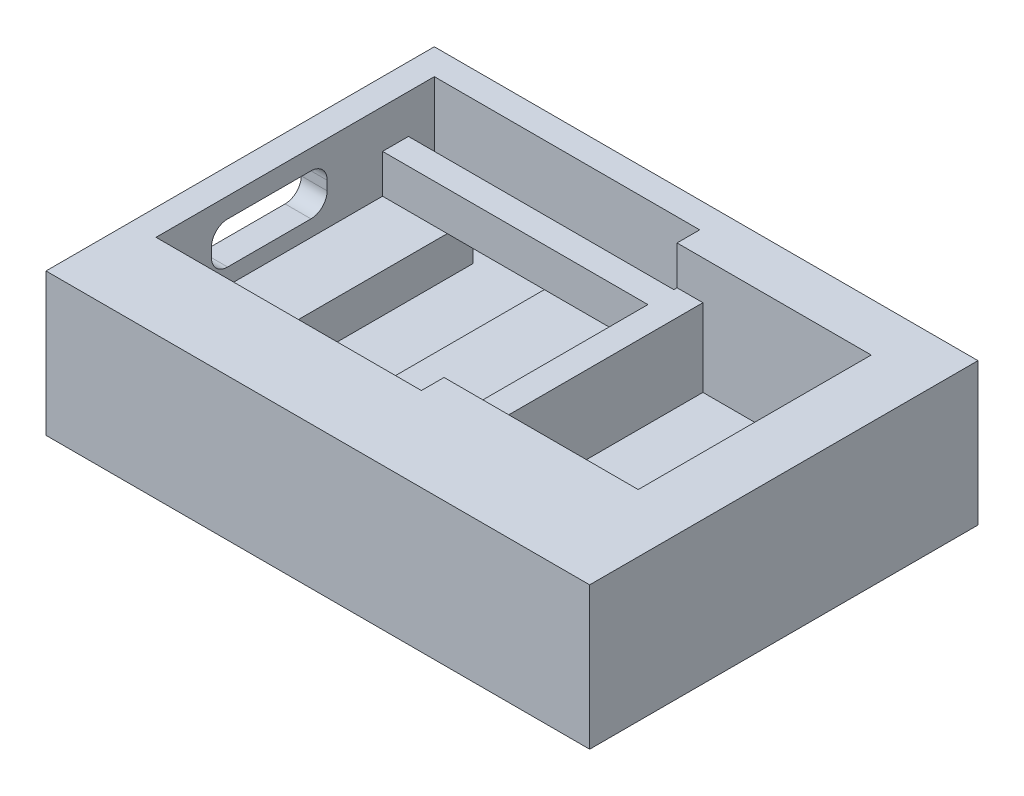
ISO-10303-21;
HEADER;
FILE_DESCRIPTION(('STEP AP214'),'2;1');
FILE_NAME('part.step','',(''),(''),'','','');
FILE_SCHEMA(('AUTOMOTIVE_DESIGN { 1 0 10303 214 1 1 1 1 }'));
ENDSEC;
DATA;
#1=APPLICATION_CONTEXT('core data for automotive mechanical design processes');
#2=APPLICATION_PROTOCOL_DEFINITION('international standard','automotive_design',2000,#1);
#3=PRODUCT_CONTEXT('',#1,'mechanical');
#4=PRODUCT('Part','Part','',(#3));
#5=PRODUCT_RELATED_PRODUCT_CATEGORY('part','',(#4));
#6=PRODUCT_DEFINITION_FORMATION('','',#4);
#7=PRODUCT_DEFINITION_CONTEXT('part definition',#1,'design');
#8=PRODUCT_DEFINITION('design','',#6,#7);
#9=PRODUCT_DEFINITION_SHAPE('','',#8);
#10=(LENGTH_UNIT() NAMED_UNIT(*) SI_UNIT(.MILLI.,.METRE.));
#11=(NAMED_UNIT(*) PLANE_ANGLE_UNIT() SI_UNIT($,.RADIAN.));
#12=(NAMED_UNIT(*) SI_UNIT($,.STERADIAN.) SOLID_ANGLE_UNIT());
#13=UNCERTAINTY_MEASURE_WITH_UNIT(LENGTH_MEASURE(1.E-05),#10,'distance_accuracy_value','');
#14=(GEOMETRIC_REPRESENTATION_CONTEXT(3) GLOBAL_UNCERTAINTY_ASSIGNED_CONTEXT((#13)) GLOBAL_UNIT_ASSIGNED_CONTEXT((#10,
#11,#12)) REPRESENTATION_CONTEXT('',''));
#15=CARTESIAN_POINT('',(0.,0.,0.));
#16=DIRECTION('',(0.,0.,1.));
#17=DIRECTION('',(1.,0.,0.));
#18=AXIS2_PLACEMENT_3D('',#15,#16,#17);
#19=CARTESIAN_POINT('',(2.,11.,-19.5));
#20=DIRECTION('',(0.,0.,1.));
#21=DIRECTION('',(1.,0.,0.));
#22=AXIS2_PLACEMENT_3D('',#19,#20,#21);
#23=PLANE('',#22);
#24=DIRECTION('',(0.,-1.,0.));
#25=VECTOR('',#24,1.);
#26=CARTESIAN_POINT('',(22.5,11.,-19.5));
#27=LINE('',#26,#25);
#28=CARTESIAN_POINT('',(22.5,8.,-19.5));
#29=VERTEX_POINT('',#28);
#30=CARTESIAN_POINT('',(22.5,5.,-19.5));
#31=VERTEX_POINT('',#30);
#32=EDGE_CURVE('E524',#29,#31,#27,.T.);
#33=ORIENTED_EDGE('',*,*,#32,.F.);
#34=DIRECTION('',(1.,0.,0.));
#35=VECTOR('',#34,1.);
#36=CARTESIAN_POINT('',(22.5,8.,-19.5));
#37=LINE('',#36,#35);
#38=CARTESIAN_POINT('',(2.,8.,-19.5));
#39=VERTEX_POINT('',#38);
#40=EDGE_CURVE('E391',#39,#29,#37,.T.);
#41=ORIENTED_EDGE('',*,*,#40,.F.);
#42=DIRECTION('',(0.,-1.,0.));
#43=VECTOR('',#42,1.);
#44=CARTESIAN_POINT('',(2.,11.,-19.5));
#45=LINE('',#44,#43);
#46=CARTESIAN_POINT('',(2.,5.,-19.5));
#47=VERTEX_POINT('',#46);
#48=EDGE_CURVE('E518',#39,#47,#45,.T.);
#49=ORIENTED_EDGE('',*,*,#48,.T.);
#50=DIRECTION('',(1.,0.,0.));
#51=VECTOR('',#50,1.);
#52=CARTESIAN_POINT('',(2.,5.,-19.5));
#53=LINE('',#52,#51);
#54=CARTESIAN_POINT('',(7.,5.,-19.5));
#55=VERTEX_POINT('',#54);
#56=EDGE_CURVE('E439',#47,#55,#53,.T.);
#57=ORIENTED_EDGE('',*,*,#56,.T.);
#58=DIRECTION('',(-1.,0.,0.));
#59=VECTOR('',#58,1.);
#60=CARTESIAN_POINT('',(7.,5.,-19.5));
#61=LINE('',#60,#59);
#62=CARTESIAN_POINT('',(14.5,5.,-19.5));
#63=VERTEX_POINT('',#62);
#64=EDGE_CURVE('E405',#63,#55,#61,.T.);
#65=ORIENTED_EDGE('',*,*,#64,.F.);
#66=DIRECTION('',(-1.,0.,0.));
#67=VECTOR('',#66,1.);
#68=CARTESIAN_POINT('',(22.5,5.,-19.5));
#69=LINE('',#68,#67);
#70=EDGE_CURVE('E431',#31,#63,#69,.T.);
#71=ORIENTED_EDGE('',*,*,#70,.F.);
#72=EDGE_LOOP('',(#33,#41,#49,#57,#65,#71));
#73=FACE_BOUND('',#72,.T.);
#74=ADVANCED_FACE('F47',(#73),#23,.T.);
#75=CARTESIAN_POINT('',(24.5,11.,-21.75));
#76=DIRECTION('',(1.,0.,0.));
#77=DIRECTION('',(0.,0.,-1.));
#78=AXIS2_PLACEMENT_3D('',#75,#76,#77);
#79=PLANE('',#78);
#80=DIRECTION('',(0.,-1.,0.));
#81=VECTOR('',#80,1.);
#82=CARTESIAN_POINT('',(24.5,11.,-21.75));
#83=LINE('',#82,#81);
#84=CARTESIAN_POINT('',(24.5,8.,-21.75));
#85=VERTEX_POINT('',#84);
#86=CARTESIAN_POINT('',(24.5,2.,-21.75));
#87=VERTEX_POINT('',#86);
#88=EDGE_CURVE('E547',#85,#87,#83,.T.);
#89=ORIENTED_EDGE('',*,*,#88,.F.);
#90=DIRECTION('',(0.,0.,-1.));
#91=VECTOR('',#90,1.);
#92=CARTESIAN_POINT('',(24.5,8.,-3.75));
#93=LINE('',#92,#91);
#94=CARTESIAN_POINT('',(24.5,8.,-3.75));
#95=VERTEX_POINT('',#94);
#96=EDGE_CURVE('E354',#95,#85,#93,.T.);
#97=ORIENTED_EDGE('',*,*,#96,.F.);
#98=DIRECTION('',(0.,-1.,0.));
#99=VECTOR('',#98,1.);
#100=CARTESIAN_POINT('',(24.5,11.,-3.75));
#101=LINE('',#100,#99);
#102=CARTESIAN_POINT('',(24.5,2.,-3.75));
#103=VERTEX_POINT('',#102);
#104=EDGE_CURVE('E571',#95,#103,#101,.T.);
#105=ORIENTED_EDGE('',*,*,#104,.T.);
#106=DIRECTION('',(0.,0.,1.));
#107=VECTOR('',#106,1.);
#108=CARTESIAN_POINT('',(24.5,2.,-21.75));
#109=LINE('',#108,#107);
#110=EDGE_CURVE('E535',#87,#103,#109,.T.);
#111=ORIENTED_EDGE('',*,*,#110,.F.);
#112=EDGE_LOOP('',(#89,#97,#105,#111));
#113=FACE_BOUND('',#112,.T.);
#114=ADVANCED_FACE('F645',(#113),#79,.T.);
#115=CARTESIAN_POINT('',(2.,11.,-21.5));
#116=DIRECTION('',(0.,0.,-1.));
#117=DIRECTION('',(-1.,0.,0.));
#118=AXIS2_PLACEMENT_3D('',#115,#116,#117);
#119=PLANE('',#118);
#120=DIRECTION('',(0.,-1.,0.));
#121=VECTOR('',#120,1.);
#122=CARTESIAN_POINT('',(2.,11.,-21.5));
#123=LINE('',#122,#121);
#124=CARTESIAN_POINT('',(2.,8.,-21.5));
#125=VERTEX_POINT('',#124);
#126=CARTESIAN_POINT('',(2.,2.,-21.5));
#127=VERTEX_POINT('',#126);
#128=EDGE_CURVE('E497',#125,#127,#123,.T.);
#129=ORIENTED_EDGE('',*,*,#128,.F.);
#130=DIRECTION('',(-1.,0.,0.));
#131=VECTOR('',#130,1.);
#132=CARTESIAN_POINT('',(22.5,8.,-21.5));
#133=LINE('',#132,#131);
#134=CARTESIAN_POINT('',(22.5,8.,-21.5));
#135=VERTEX_POINT('',#134);
#136=EDGE_CURVE('E384',#135,#125,#133,.T.);
#137=ORIENTED_EDGE('',*,*,#136,.F.);
#138=DIRECTION('',(0.,-1.,0.));
#139=VECTOR('',#138,1.);
#140=CARTESIAN_POINT('',(22.5,11.,-21.5));
#141=LINE('',#140,#139);
#142=CARTESIAN_POINT('',(22.5,2.,-21.5));
#143=VERTEX_POINT('',#142);
#144=EDGE_CURVE('E479',#135,#143,#141,.T.);
#145=ORIENTED_EDGE('',*,*,#144,.T.);
#146=DIRECTION('',(1.,0.,0.));
#147=VECTOR('',#146,1.);
#148=CARTESIAN_POINT('',(2.,2.,-21.5));
#149=LINE('',#148,#147);
#150=CARTESIAN_POINT('',(14.5,2.,-21.5));
#151=VERTEX_POINT('',#150);
#152=EDGE_CURVE('E491',#151,#143,#149,.T.);
#153=ORIENTED_EDGE('',*,*,#152,.F.);
#154=DIRECTION('',(0.,-1.,0.));
#155=VECTOR('',#154,1.);
#156=CARTESIAN_POINT('',(14.5,11.,-21.5));
#157=LINE('',#156,#155);
#158=CARTESIAN_POINT('',(14.5,5.,-21.5));
#159=VERTEX_POINT('',#158);
#160=EDGE_CURVE('E416',#159,#151,#157,.T.);
#161=ORIENTED_EDGE('',*,*,#160,.F.);
#162=DIRECTION('',(1.,0.,0.));
#163=VECTOR('',#162,1.);
#164=CARTESIAN_POINT('',(2.,5.,-21.5));
#165=LINE('',#164,#163);
#166=CARTESIAN_POINT('',(7.,5.,-21.5));
#167=VERTEX_POINT('',#166);
#168=EDGE_CURVE('E11',#167,#159,#165,.T.);
#169=ORIENTED_EDGE('',*,*,#168,.F.);
#170=DIRECTION('',(0.,1.,0.));
#171=VECTOR('',#170,1.);
#172=CARTESIAN_POINT('',(7.,11.,-21.5));
#173=LINE('',#172,#171);
#174=CARTESIAN_POINT('',(7.,2.,-21.5));
#175=VERTEX_POINT('',#174);
#176=EDGE_CURVE('E422',#175,#167,#173,.T.);
#177=ORIENTED_EDGE('',*,*,#176,.F.);
#178=EDGE_CURVE('E475',#127,#175,#149,.T.);
#179=ORIENTED_EDGE('',*,*,#178,.F.);
#180=EDGE_LOOP('',(#129,#137,#145,#153,#161,#169,#177,#179));
#181=FACE_BOUND('',#180,.T.);
#182=ADVANCED_FACE('F669',(#181),#119,.T.);
#183=CARTESIAN_POINT('',(2.,11.,-2.));
#184=DIRECTION('',(0.,0.,-1.));
#185=DIRECTION('',(-1.,0.,0.));
#186=AXIS2_PLACEMENT_3D('',#183,#184,#185);
#187=PLANE('',#186);
#188=DIRECTION('',(0.,-1.,0.));
#189=VECTOR('',#188,1.);
#190=CARTESIAN_POINT('',(22.5,11.,-2.));
#191=LINE('',#190,#189);
#192=CARTESIAN_POINT('',(22.5,11.,-2.));
#193=VERTEX_POINT('',#192);
#194=CARTESIAN_POINT('',(22.5,5.,-1.99999999999999));
#195=VERTEX_POINT('',#194);
#196=EDGE_CURVE('E527',#193,#195,#191,.T.);
#197=ORIENTED_EDGE('',*,*,#196,.T.);
#198=DIRECTION('',(-1.,0.,0.));
#199=VECTOR('',#198,1.);
#200=CARTESIAN_POINT('',(22.5,5.,-1.99999999999999));
#201=LINE('',#200,#199);
#202=CARTESIAN_POINT('',(14.5,5.,-1.99999999999999));
#203=VERTEX_POINT('',#202);
#204=EDGE_CURVE('E430',#195,#203,#201,.T.);
#205=ORIENTED_EDGE('',*,*,#204,.T.);
#206=DIRECTION('',(0.,1.,0.));
#207=VECTOR('',#206,1.);
#208=CARTESIAN_POINT('',(14.5,2.,-1.99999999999999));
#209=LINE('',#208,#207);
#210=CARTESIAN_POINT('',(14.5,2.,-1.99999999999999));
#211=VERTEX_POINT('',#210);
#212=EDGE_CURVE('E426',#211,#203,#209,.T.);
#213=ORIENTED_EDGE('',*,*,#212,.F.);
#214=DIRECTION('',(1.,0.,0.));
#215=VECTOR('',#214,1.);
#216=CARTESIAN_POINT('',(2.,2.,-2.));
#217=LINE('',#216,#215);
#218=CARTESIAN_POINT('',(7.,2.,-2.));
#219=VERTEX_POINT('',#218);
#220=EDGE_CURVE('E507',#219,#211,#217,.T.);
#221=ORIENTED_EDGE('',*,*,#220,.F.);
#222=DIRECTION('',(0.,1.,0.));
#223=VECTOR('',#222,1.);
#224=CARTESIAN_POINT('',(7.,2.,-1.99999999999999));
#225=LINE('',#224,#223);
#226=CARTESIAN_POINT('',(7.,5.,-2.));
#227=VERTEX_POINT('',#226);
#228=EDGE_CURVE('E465',#219,#227,#225,.T.);
#229=ORIENTED_EDGE('',*,*,#228,.T.);
#230=DIRECTION('',(1.,0.,0.));
#231=VECTOR('',#230,1.);
#232=CARTESIAN_POINT('',(2.,5.,-1.99999999999999));
#233=LINE('',#232,#231);
#234=CARTESIAN_POINT('',(2.,5.,-2.));
#235=VERTEX_POINT('',#234);
#236=EDGE_CURVE('E461',#235,#227,#233,.T.);
#237=ORIENTED_EDGE('',*,*,#236,.F.);
#238=DIRECTION('',(0.,-1.,0.));
#239=VECTOR('',#238,1.);
#240=CARTESIAN_POINT('',(2.,11.,-2.));
#241=LINE('',#240,#239);
#242=CARTESIAN_POINT('',(2.,11.,-2.));
#243=VERTEX_POINT('',#242);
#244=EDGE_CURVE('E531',#243,#235,#241,.T.);
#245=ORIENTED_EDGE('',*,*,#244,.F.);
#246=DIRECTION('',(1.,0.,0.));
#247=VECTOR('',#246,1.);
#248=CARTESIAN_POINT('',(2.,11.,-2.));
#249=LINE('',#248,#247);
#250=EDGE_CURVE('E511',#243,#193,#249,.T.);
#251=ORIENTED_EDGE('',*,*,#250,.T.);
#252=EDGE_LOOP('',(#197,#205,#213,#221,#229,#237,#245,#251));
#253=FACE_BOUND('',#252,.T.);
#254=ADVANCED_FACE('F612',(#253),#187,.T.);
#255=CARTESIAN_POINT('',(22.5,11.,-2.));
#256=DIRECTION('',(-1.,0.,0.));
#257=DIRECTION('',(0.,0.,1.));
#258=AXIS2_PLACEMENT_3D('',#255,#256,#257);
#259=PLANE('',#258);
#260=DIRECTION('',(0.,1.,0.));
#261=VECTOR('',#260,1.);
#262=CARTESIAN_POINT('',(22.5,8.,-3.75));
#263=LINE('',#262,#261);
#264=CARTESIAN_POINT('',(22.5,8.,-3.75));
#265=VERTEX_POINT('',#264);
#266=CARTESIAN_POINT('',(22.5,11.,-3.75));
#267=VERTEX_POINT('',#266);
#268=EDGE_CURVE('E401',#265,#267,#263,.T.);
#269=ORIENTED_EDGE('',*,*,#268,.F.);
#270=DIRECTION('',(0.,0.,1.));
#271=VECTOR('',#270,1.);
#272=CARTESIAN_POINT('',(22.5,8.,-3.75));
#273=LINE('',#272,#271);
#274=EDGE_CURVE('E394',#29,#265,#273,.T.);
#275=ORIENTED_EDGE('',*,*,#274,.F.);
#276=ORIENTED_EDGE('',*,*,#32,.T.);
#277=DIRECTION('',(0.,0.,-1.));
#278=VECTOR('',#277,1.);
#279=CARTESIAN_POINT('',(22.5,5.,-1.99999999999999));
#280=LINE('',#279,#278);
#281=EDGE_CURVE('E440',#195,#31,#280,.T.);
#282=ORIENTED_EDGE('',*,*,#281,.F.);
#283=ORIENTED_EDGE('',*,*,#196,.F.);
#284=DIRECTION('',(0.,0.,-1.));
#285=VECTOR('',#284,1.);
#286=CARTESIAN_POINT('',(22.5,11.,-2.));
#287=LINE('',#286,#285);
#288=EDGE_CURVE('E514',#193,#267,#287,.T.);
#289=ORIENTED_EDGE('',*,*,#288,.T.);
#290=EDGE_LOOP('',(#269,#275,#276,#282,#283,#289));
#291=FACE_BOUND('',#290,.T.);
#292=ADVANCED_FACE('F609',(#291),#259,.T.);
#293=CARTESIAN_POINT('',(0.,2.,-25.5));
#294=DIRECTION('',(0.,0.,-1.));
#295=DIRECTION('',(-1.,0.,0.));
#296=AXIS2_PLACEMENT_3D('',#293,#294,#295);
#297=PLANE('',#296);
#298=DIRECTION('',(1.,0.,0.));
#299=VECTOR('',#298,1.);
#300=CARTESIAN_POINT('',(0.,0.,-25.5));
#301=LINE('',#300,#299);
#302=CARTESIAN_POINT('',(0.,0.,-25.5));
#303=VERTEX_POINT('',#302);
#304=CARTESIAN_POINT('',(42.,0.,-25.5));
#305=VERTEX_POINT('',#304);
#306=EDGE_CURVE('E268',#303,#305,#301,.T.);
#307=ORIENTED_EDGE('',*,*,#306,.F.);
#308=DIRECTION('',(0.,-1.,0.));
#309=VECTOR('',#308,1.);
#310=CARTESIAN_POINT('',(0.,2.,-25.5));
#311=LINE('',#310,#309);
#312=CARTESIAN_POINT('',(0.,11.,-25.5));
#313=VERTEX_POINT('',#312);
#314=EDGE_CURVE('E56',#313,#303,#311,.T.);
#315=ORIENTED_EDGE('',*,*,#314,.F.);
#316=DIRECTION('',(-1.,0.,0.));
#317=VECTOR('',#316,1.);
#318=CARTESIAN_POINT('',(24.5,11.,-25.5));
#319=LINE('',#318,#317);
#320=CARTESIAN_POINT('',(42.,11.,-25.5));
#321=VERTEX_POINT('',#320);
#322=EDGE_CURVE('E574',#321,#313,#319,.T.);
#323=ORIENTED_EDGE('',*,*,#322,.F.);
#324=DIRECTION('',(0.,1.,0.));
#325=VECTOR('',#324,1.);
#326=CARTESIAN_POINT('',(42.,11.,-25.5));
#327=LINE('',#326,#325);
#328=EDGE_CURVE('E273',#305,#321,#327,.T.);
#329=ORIENTED_EDGE('',*,*,#328,.F.);
#330=EDGE_LOOP('',(#307,#315,#323,#329));
#331=FACE_BOUND('',#330,.T.);
#332=ADVANCED_FACE('F589',(#331),#297,.T.);
#333=CARTESIAN_POINT('',(0.,2.,-25.5));
#334=DIRECTION('',(1.,0.,0.));
#335=DIRECTION('',(0.,0.,-1.));
#336=AXIS2_PLACEMENT_3D('',#333,#334,#335);
#337=PLANE('',#336);
#338=DIRECTION('',(0.,-1.,0.));
#339=VECTOR('',#338,1.);
#340=CARTESIAN_POINT('',(0.,7.5,-6.28));
#341=LINE('',#340,#339);
#342=CARTESIAN_POINT('',(0.,8.21,-6.27999999999999));
#343=VERTEX_POINT('',#342);
#344=CARTESIAN_POINT('',(0.,7.5,-6.28));
#345=VERTEX_POINT('',#344);
#346=EDGE_CURVE('E317',#343,#345,#341,.T.);
#347=ORIENTED_EDGE('',*,*,#346,.T.);
#348=CARTESIAN_POINT('',(0.,7.5,-7.52999999999999));
#349=DIRECTION('',(1.,0.,0.));
#350=DIRECTION('',(0.,0.,-1.));
#351=AXIS2_PLACEMENT_3D('',#348,#349,#350);
#352=CIRCLE('',#351,1.25);
#353=CARTESIAN_POINT('',(0.,6.25,-7.52999999999999));
#354=VERTEX_POINT('',#353);
#355=EDGE_CURVE('E290',#345,#354,#352,.T.);
#356=ORIENTED_EDGE('',*,*,#355,.T.);
#357=DIRECTION('',(0.,0.,-1.));
#358=VECTOR('',#357,1.);
#359=CARTESIAN_POINT('',(0.,6.25,-7.52999999999999));
#360=LINE('',#359,#358);
#361=CARTESIAN_POINT('',(0.,6.25,-13.97));
#362=VERTEX_POINT('',#361);
#363=EDGE_CURVE('E294',#354,#362,#360,.T.);
#364=ORIENTED_EDGE('',*,*,#363,.T.);
#365=CARTESIAN_POINT('',(0.,7.5,-13.97));
#366=DIRECTION('',(1.,0.,0.));
#367=DIRECTION('',(0.,0.,-1.));
#368=AXIS2_PLACEMENT_3D('',#365,#366,#367);
#369=CIRCLE('',#368,1.25);
#370=CARTESIAN_POINT('',(0.,7.5,-15.22));
#371=VERTEX_POINT('',#370);
#372=EDGE_CURVE('E63',#362,#371,#369,.T.);
#373=ORIENTED_EDGE('',*,*,#372,.T.);
#374=DIRECTION('',(0.,1.,0.));
#375=VECTOR('',#374,1.);
#376=CARTESIAN_POINT('',(0.,8.21,-15.22));
#377=LINE('',#376,#375);
#378=CARTESIAN_POINT('',(0.,8.21,-15.22));
#379=VERTEX_POINT('',#378);
#380=EDGE_CURVE('E301',#371,#379,#377,.T.);
#381=ORIENTED_EDGE('',*,*,#380,.T.);
#382=CARTESIAN_POINT('',(0.,8.21,-13.97));
#383=DIRECTION('',(1.,0.,0.));
#384=DIRECTION('',(0.,0.,-1.));
#385=AXIS2_PLACEMENT_3D('',#382,#383,#384);
#386=CIRCLE('',#385,1.25);
#387=CARTESIAN_POINT('',(0.,9.46,-13.97));
#388=VERTEX_POINT('',#387);
#389=EDGE_CURVE('E305',#379,#388,#386,.T.);
#390=ORIENTED_EDGE('',*,*,#389,.T.);
#391=DIRECTION('',(0.,0.,1.));
#392=VECTOR('',#391,1.);
#393=CARTESIAN_POINT('',(0.,9.46,-7.52999999999999));
#394=LINE('',#393,#392);
#395=CARTESIAN_POINT('',(0.,9.46,-7.52999999999999));
#396=VERTEX_POINT('',#395);
#397=EDGE_CURVE('E309',#388,#396,#394,.T.);
#398=ORIENTED_EDGE('',*,*,#397,.T.);
#399=CARTESIAN_POINT('',(0.,8.21,-7.52999999999999));
#400=DIRECTION('',(1.,0.,0.));
#401=DIRECTION('',(0.,0.,-1.));
#402=AXIS2_PLACEMENT_3D('',#399,#400,#401);
#403=CIRCLE('',#402,1.25);
#404=EDGE_CURVE('E313',#396,#343,#403,.T.);
#405=ORIENTED_EDGE('',*,*,#404,.T.);
#406=EDGE_LOOP('',(#347,#356,#364,#373,#381,#390,#398,#405));
#407=FACE_BOUND('',#406,.T.);
#408=DIRECTION('',(0.,0.,1.));
#409=VECTOR('',#408,1.);
#410=CARTESIAN_POINT('',(0.,0.,-25.5));
#411=LINE('',#410,#409);
#412=CARTESIAN_POINT('',(0.,0.,4.5));
#413=VERTEX_POINT('',#412);
#414=EDGE_CURVE('E581',#303,#413,#411,.T.);
#415=ORIENTED_EDGE('',*,*,#414,.T.);
#416=DIRECTION('',(0.,-1.,0.));
#417=VECTOR('',#416,1.);
#418=CARTESIAN_POINT('',(0.,11.,4.5));
#419=LINE('',#418,#417);
#420=CARTESIAN_POINT('',(0.,11.,4.5));
#421=VERTEX_POINT('',#420);
#422=EDGE_CURVE('E258',#421,#413,#419,.T.);
#423=ORIENTED_EDGE('',*,*,#422,.F.);
#424=DIRECTION('',(0.,0.,1.));
#425=VECTOR('',#424,1.);
#426=CARTESIAN_POINT('',(0.,11.,-25.5));
#427=LINE('',#426,#425);
#428=EDGE_CURVE('E578',#313,#421,#427,.T.);
#429=ORIENTED_EDGE('',*,*,#428,.F.);
#430=ORIENTED_EDGE('',*,*,#314,.T.);
#431=EDGE_LOOP('',(#415,#423,#429,#430));
#432=FACE_BOUND('',#431,.T.);
#433=ADVANCED_FACE('F49',(#407,#432),#337,.F.);
#434=CARTESIAN_POINT('',(0.,0.,0.));
#435=DIRECTION('',(0.,-1.,0.));
#436=DIRECTION('',(0.,0.,-1.));
#437=AXIS2_PLACEMENT_3D('',#434,#435,#436);
#438=PLANE('',#437);
#439=ORIENTED_EDGE('',*,*,#306,.T.);
#440=DIRECTION('',(0.,0.,-1.));
#441=VECTOR('',#440,1.);
#442=CARTESIAN_POINT('',(42.,0.,4.5));
#443=LINE('',#442,#441);
#444=CARTESIAN_POINT('',(42.,0.,4.5));
#445=VERTEX_POINT('',#444);
#446=EDGE_CURVE('E265',#445,#305,#443,.T.);
#447=ORIENTED_EDGE('',*,*,#446,.F.);
#448=DIRECTION('',(1.,0.,0.));
#449=VECTOR('',#448,1.);
#450=CARTESIAN_POINT('',(0.,0.,4.5));
#451=LINE('',#450,#449);
#452=EDGE_CURVE('E251',#413,#445,#451,.T.);
#453=ORIENTED_EDGE('',*,*,#452,.F.);
#454=ORIENTED_EDGE('',*,*,#414,.F.);
#455=EDGE_LOOP('',(#439,#447,#453,#454));
#456=FACE_BOUND('',#455,.T.);
#457=ADVANCED_FACE('F266',(#456),#438,.T.);
#458=CARTESIAN_POINT('',(0.,11.,0.));
#459=DIRECTION('',(0.,-1.,0.));
#460=DIRECTION('',(0.,0.,-1.));
#461=AXIS2_PLACEMENT_3D('',#458,#459,#460);
#462=PLANE('',#461);
#463=DIRECTION('',(-1.,0.,0.));
#464=VECTOR('',#463,1.);
#465=CARTESIAN_POINT('',(0.,11.,4.5));
#466=LINE('',#465,#464);
#467=CARTESIAN_POINT('',(42.,11.,4.5));
#468=VERTEX_POINT('',#467);
#469=EDGE_CURVE('E262',#468,#421,#466,.T.);
#470=ORIENTED_EDGE('',*,*,#469,.F.);
#471=DIRECTION('',(0.,0.,1.));
#472=VECTOR('',#471,1.);
#473=CARTESIAN_POINT('',(42.,11.,4.5));
#474=LINE('',#473,#472);
#475=EDGE_CURVE('E278',#321,#468,#474,.T.);
#476=ORIENTED_EDGE('',*,*,#475,.F.);
#477=ORIENTED_EDGE('',*,*,#322,.T.);
#478=ORIENTED_EDGE('',*,*,#428,.T.);
#479=EDGE_LOOP('',(#470,#476,#477,#478));
#480=FACE_BOUND('',#479,.T.);
#481=DIRECTION('',(1.,0.,0.));
#482=VECTOR('',#481,1.);
#483=CARTESIAN_POINT('',(24.5,11.,-3.75));
#484=LINE('',#483,#482);
#485=CARTESIAN_POINT('',(37.5,11.,-3.75));
#486=VERTEX_POINT('',#485);
#487=EDGE_CURVE('E536',#267,#486,#484,.T.);
#488=ORIENTED_EDGE('',*,*,#487,.F.);
#489=ORIENTED_EDGE('',*,*,#288,.F.);
#490=ORIENTED_EDGE('',*,*,#250,.F.);
#491=DIRECTION('',(0.,0.,1.));
#492=VECTOR('',#491,1.);
#493=CARTESIAN_POINT('',(2.,11.,-2.));
#494=LINE('',#493,#492);
#495=CARTESIAN_POINT('',(2.,11.,-23.5));
#496=VERTEX_POINT('',#495);
#497=EDGE_CURVE('E508',#496,#243,#494,.T.);
#498=ORIENTED_EDGE('',*,*,#497,.F.);
#499=DIRECTION('',(-1.,0.,0.));
#500=VECTOR('',#499,1.);
#501=CARTESIAN_POINT('',(2.,11.,-23.5));
#502=LINE('',#501,#500);
#503=CARTESIAN_POINT('',(22.5,11.,-23.5));
#504=VERTEX_POINT('',#503);
#505=EDGE_CURVE('E474',#504,#496,#502,.T.);
#506=ORIENTED_EDGE('',*,*,#505,.F.);
#507=DIRECTION('',(0.,0.,-1.));
#508=VECTOR('',#507,1.);
#509=CARTESIAN_POINT('',(22.5,11.,-21.5));
#510=LINE('',#509,#508);
#511=CARTESIAN_POINT('',(22.5,11.,-21.75));
#512=VERTEX_POINT('',#511);
#513=EDGE_CURVE('E471',#512,#504,#510,.T.);
#514=ORIENTED_EDGE('',*,*,#513,.F.);
#515=DIRECTION('',(-1.,0.,0.));
#516=VECTOR('',#515,1.);
#517=CARTESIAN_POINT('',(24.5,11.,-21.75));
#518=LINE('',#517,#516);
#519=CARTESIAN_POINT('',(37.5,11.,-21.75));
#520=VERTEX_POINT('',#519);
#521=EDGE_CURVE('E544',#520,#512,#518,.T.);
#522=ORIENTED_EDGE('',*,*,#521,.F.);
#523=DIRECTION('',(0.,0.,-1.));
#524=VECTOR('',#523,1.);
#525=CARTESIAN_POINT('',(37.5,11.,-21.75));
#526=LINE('',#525,#524);
#527=EDGE_CURVE('E539',#486,#520,#526,.T.);
#528=ORIENTED_EDGE('',*,*,#527,.F.);
#529=EDGE_LOOP('',(#488,#489,#490,#498,#506,#514,#522,#528));
#530=FACE_BOUND('',#529,.T.);
#531=ADVANCED_FACE('F591',(#480,#530),#462,.F.);
#532=CARTESIAN_POINT('',(24.5,11.,-3.75));
#533=DIRECTION('',(0.,0.,-1.));
#534=DIRECTION('',(-1.,0.,0.));
#535=AXIS2_PLACEMENT_3D('',#532,#533,#534);
#536=PLANE('',#535);
#537=DIRECTION('',(1.,0.,0.));
#538=VECTOR('',#537,1.);
#539=CARTESIAN_POINT('',(24.5,2.,-3.75));
#540=LINE('',#539,#538);
#541=CARTESIAN_POINT('',(37.5,2.,-3.75));
#542=VERTEX_POINT('',#541);
#543=EDGE_CURVE('E551',#103,#542,#540,.T.);
#544=ORIENTED_EDGE('',*,*,#543,.F.);
#545=ORIENTED_EDGE('',*,*,#104,.F.);
#546=DIRECTION('',(1.,0.,0.));
#547=VECTOR('',#546,1.);
#548=CARTESIAN_POINT('',(24.5,8.,-3.75));
#549=LINE('',#548,#547);
#550=EDGE_CURVE('E397',#265,#95,#549,.T.);
#551=ORIENTED_EDGE('',*,*,#550,.F.);
#552=ORIENTED_EDGE('',*,*,#268,.T.);
#553=ORIENTED_EDGE('',*,*,#487,.T.);
#554=DIRECTION('',(0.,-1.,0.));
#555=VECTOR('',#554,1.);
#556=CARTESIAN_POINT('',(37.5,11.,-3.75));
#557=LINE('',#556,#555);
#558=EDGE_CURVE('E568',#486,#542,#557,.T.);
#559=ORIENTED_EDGE('',*,*,#558,.T.);
#560=EDGE_LOOP('',(#544,#545,#551,#552,#553,#559));
#561=FACE_BOUND('',#560,.T.);
#562=ADVANCED_FACE('F594',(#561),#536,.T.);
#563=CARTESIAN_POINT('',(37.5,11.,-21.75));
#564=DIRECTION('',(-1.,0.,0.));
#565=DIRECTION('',(0.,0.,1.));
#566=AXIS2_PLACEMENT_3D('',#563,#564,#565);
#567=PLANE('',#566);
#568=DIRECTION('',(0.,0.,-1.));
#569=VECTOR('',#568,1.);
#570=CARTESIAN_POINT('',(37.5,2.,-21.75));
#571=LINE('',#570,#569);
#572=CARTESIAN_POINT('',(37.5,2.,-21.75));
#573=VERTEX_POINT('',#572);
#574=EDGE_CURVE('E555',#542,#573,#571,.T.);
#575=ORIENTED_EDGE('',*,*,#574,.F.);
#576=ORIENTED_EDGE('',*,*,#558,.F.);
#577=ORIENTED_EDGE('',*,*,#527,.T.);
#578=DIRECTION('',(0.,-1.,0.));
#579=VECTOR('',#578,1.);
#580=CARTESIAN_POINT('',(37.5,11.,-21.75));
#581=LINE('',#580,#579);
#582=EDGE_CURVE('E564',#520,#573,#581,.T.);
#583=ORIENTED_EDGE('',*,*,#582,.T.);
#584=EDGE_LOOP('',(#575,#576,#577,#583));
#585=FACE_BOUND('',#584,.T.);
#586=ADVANCED_FACE('F639',(#585),#567,.T.);
#587=CARTESIAN_POINT('',(24.5,11.,-21.75));
#588=DIRECTION('',(0.,0.,1.));
#589=DIRECTION('',(1.,0.,0.));
#590=AXIS2_PLACEMENT_3D('',#587,#588,#589);
#591=PLANE('',#590);
#592=DIRECTION('',(-1.,0.,0.));
#593=VECTOR('',#592,1.);
#594=CARTESIAN_POINT('',(24.5,2.,-21.75));
#595=LINE('',#594,#593);
#596=EDGE_CURVE('E540',#573,#87,#595,.T.);
#597=ORIENTED_EDGE('',*,*,#596,.F.);
#598=ORIENTED_EDGE('',*,*,#582,.F.);
#599=ORIENTED_EDGE('',*,*,#521,.T.);
#600=DIRECTION('',(0.,1.,0.));
#601=VECTOR('',#600,1.);
#602=CARTESIAN_POINT('',(22.5,8.,-21.75));
#603=LINE('',#602,#601);
#604=CARTESIAN_POINT('',(22.5,8.,-21.75));
#605=VERTEX_POINT('',#604);
#606=EDGE_CURVE('E400',#605,#512,#603,.T.);
#607=ORIENTED_EDGE('',*,*,#606,.F.);
#608=DIRECTION('',(-1.,0.,0.));
#609=VECTOR('',#608,1.);
#610=CARTESIAN_POINT('',(24.5,8.,-21.75));
#611=LINE('',#610,#609);
#612=EDGE_CURVE('E377',#85,#605,#611,.T.);
#613=ORIENTED_EDGE('',*,*,#612,.F.);
#614=ORIENTED_EDGE('',*,*,#88,.T.);
#615=EDGE_LOOP('',(#597,#598,#599,#607,#613,#614));
#616=FACE_BOUND('',#615,.T.);
#617=ADVANCED_FACE('F635',(#616),#591,.T.);
#618=CARTESIAN_POINT('',(2.,11.,-2.));
#619=DIRECTION('',(1.,0.,0.));
#620=DIRECTION('',(0.,0.,-1.));
#621=AXIS2_PLACEMENT_3D('',#618,#619,#620);
#622=PLANE('',#621);
#623=CARTESIAN_POINT('',(2.,7.5,-7.52999999999999));
#624=DIRECTION('',(1.,0.,0.));
#625=DIRECTION('',(0.,0.,-1.));
#626=AXIS2_PLACEMENT_3D('',#623,#624,#625);
#627=CIRCLE('',#626,1.25);
#628=CARTESIAN_POINT('',(2.,7.5,-6.28));
#629=VERTEX_POINT('',#628);
#630=CARTESIAN_POINT('',(2.,6.25,-7.52999999999999));
#631=VERTEX_POINT('',#630);
#632=EDGE_CURVE('E71',#629,#631,#627,.T.);
#633=ORIENTED_EDGE('',*,*,#632,.F.);
#634=DIRECTION('',(0.,-1.,0.));
#635=VECTOR('',#634,1.);
#636=CARTESIAN_POINT('',(2.,7.5,-6.28));
#637=LINE('',#636,#635);
#638=CARTESIAN_POINT('',(2.,8.21,-6.27999999999999));
#639=VERTEX_POINT('',#638);
#640=EDGE_CURVE('E295',#639,#629,#637,.T.);
#641=ORIENTED_EDGE('',*,*,#640,.F.);
#642=CARTESIAN_POINT('',(2.,8.21,-7.52999999999999));
#643=DIRECTION('',(1.,0.,0.));
#644=DIRECTION('',(0.,0.,-1.));
#645=AXIS2_PLACEMENT_3D('',#642,#643,#644);
#646=CIRCLE('',#645,1.25);
#647=CARTESIAN_POINT('',(2.,9.46,-7.52999999999999));
#648=VERTEX_POINT('',#647);
#649=EDGE_CURVE('E344',#648,#639,#646,.T.);
#650=ORIENTED_EDGE('',*,*,#649,.F.);
#651=DIRECTION('',(0.,0.,1.));
#652=VECTOR('',#651,1.);
#653=CARTESIAN_POINT('',(2.,9.46,-7.52999999999999));
#654=LINE('',#653,#652);
#655=CARTESIAN_POINT('',(2.,9.46,-13.97));
#656=VERTEX_POINT('',#655);
#657=EDGE_CURVE('E340',#656,#648,#654,.T.);
#658=ORIENTED_EDGE('',*,*,#657,.F.);
#659=CARTESIAN_POINT('',(2.,8.21,-13.97));
#660=DIRECTION('',(1.,0.,0.));
#661=DIRECTION('',(0.,0.,-1.));
#662=AXIS2_PLACEMENT_3D('',#659,#660,#661);
#663=CIRCLE('',#662,1.25);
#664=CARTESIAN_POINT('',(2.,8.21,-15.22));
#665=VERTEX_POINT('',#664);
#666=EDGE_CURVE('E336',#665,#656,#663,.T.);
#667=ORIENTED_EDGE('',*,*,#666,.F.);
#668=DIRECTION('',(0.,1.,0.));
#669=VECTOR('',#668,1.);
#670=CARTESIAN_POINT('',(2.,8.21,-15.22));
#671=LINE('',#670,#669);
#672=CARTESIAN_POINT('',(2.,7.5,-15.22));
#673=VERTEX_POINT('',#672);
#674=EDGE_CURVE('E332',#673,#665,#671,.T.);
#675=ORIENTED_EDGE('',*,*,#674,.F.);
#676=CARTESIAN_POINT('',(2.,7.5,-13.97));
#677=DIRECTION('',(1.,0.,0.));
#678=DIRECTION('',(0.,0.,-1.));
#679=AXIS2_PLACEMENT_3D('',#676,#677,#678);
#680=CIRCLE('',#679,1.25);
#681=CARTESIAN_POINT('',(2.,6.25,-13.97));
#682=VERTEX_POINT('',#681);
#683=EDGE_CURVE('E328',#682,#673,#680,.T.);
#684=ORIENTED_EDGE('',*,*,#683,.F.);
#685=DIRECTION('',(0.,0.,-1.));
#686=VECTOR('',#685,1.);
#687=CARTESIAN_POINT('',(2.,6.25,-7.52999999999999));
#688=LINE('',#687,#686);
#689=EDGE_CURVE('E324',#631,#682,#688,.T.);
#690=ORIENTED_EDGE('',*,*,#689,.F.);
#691=EDGE_LOOP('',(#633,#641,#650,#658,#667,#675,#684,#690));
#692=FACE_BOUND('',#691,.T.);
#693=DIRECTION('',(0.,0.,-1.));
#694=VECTOR('',#693,1.);
#695=CARTESIAN_POINT('',(2.,5.,-1.99999999999999));
#696=LINE('',#695,#694);
#697=EDGE_CURVE('E457',#235,#47,#696,.T.);
#698=ORIENTED_EDGE('',*,*,#697,.T.);
#699=ORIENTED_EDGE('',*,*,#48,.F.);
#700=DIRECTION('',(0.,0.,1.));
#701=VECTOR('',#700,1.);
#702=CARTESIAN_POINT('',(2.,8.,-19.5));
#703=LINE('',#702,#701);
#704=EDGE_CURVE('E388',#125,#39,#703,.T.);
#705=ORIENTED_EDGE('',*,*,#704,.F.);
#706=ORIENTED_EDGE('',*,*,#128,.T.);
#707=DIRECTION('',(0.,0.,1.));
#708=VECTOR('',#707,1.);
#709=CARTESIAN_POINT('',(2.,2.,-21.5));
#710=LINE('',#709,#708);
#711=CARTESIAN_POINT('',(2.,2.,-23.5));
#712=VERTEX_POINT('',#711);
#713=EDGE_CURVE('E487',#712,#127,#710,.T.);
#714=ORIENTED_EDGE('',*,*,#713,.F.);
#715=DIRECTION('',(0.,-1.,0.));
#716=VECTOR('',#715,1.);
#717=CARTESIAN_POINT('',(2.,11.,-23.5));
#718=LINE('',#717,#716);
#719=EDGE_CURVE('E500',#496,#712,#718,.T.);
#720=ORIENTED_EDGE('',*,*,#719,.F.);
#721=ORIENTED_EDGE('',*,*,#497,.T.);
#722=ORIENTED_EDGE('',*,*,#244,.T.);
#723=EDGE_LOOP('',(#698,#699,#705,#706,#714,#720,#721,#722));
#724=FACE_BOUND('',#723,.T.);
#725=ADVANCED_FACE('F623',(#692,#724),#622,.T.);
#726=CARTESIAN_POINT('',(22.5,11.,-21.5));
#727=DIRECTION('',(-1.,0.,0.));
#728=DIRECTION('',(0.,0.,1.));
#729=AXIS2_PLACEMENT_3D('',#726,#727,#728);
#730=PLANE('',#729);
#731=ORIENTED_EDGE('',*,*,#606,.T.);
#732=ORIENTED_EDGE('',*,*,#513,.T.);
#733=DIRECTION('',(0.,-1.,0.));
#734=VECTOR('',#733,1.);
#735=CARTESIAN_POINT('',(22.5,11.,-23.5));
#736=LINE('',#735,#734);
#737=CARTESIAN_POINT('',(22.5,2.,-23.5));
#738=VERTEX_POINT('',#737);
#739=EDGE_CURVE('E503',#504,#738,#736,.T.);
#740=ORIENTED_EDGE('',*,*,#739,.T.);
#741=DIRECTION('',(0.,0.,-1.));
#742=VECTOR('',#741,1.);
#743=CARTESIAN_POINT('',(22.5,2.,-21.5));
#744=LINE('',#743,#742);
#745=EDGE_CURVE('E444',#143,#738,#744,.T.);
#746=ORIENTED_EDGE('',*,*,#745,.F.);
#747=ORIENTED_EDGE('',*,*,#144,.F.);
#748=DIRECTION('',(0.,0.,1.));
#749=VECTOR('',#748,1.);
#750=CARTESIAN_POINT('',(22.5,8.,-21.75));
#751=LINE('',#750,#749);
#752=EDGE_CURVE('E381',#605,#135,#751,.T.);
#753=ORIENTED_EDGE('',*,*,#752,.F.);
#754=EDGE_LOOP('',(#731,#732,#740,#746,#747,#753));
#755=FACE_BOUND('',#754,.T.);
#756=ADVANCED_FACE('F631',(#755),#730,.T.);
#757=CARTESIAN_POINT('',(2.,11.,-23.5));
#758=DIRECTION('',(0.,0.,1.));
#759=DIRECTION('',(1.,0.,0.));
#760=AXIS2_PLACEMENT_3D('',#757,#758,#759);
#761=PLANE('',#760);
#762=DIRECTION('',(-1.,0.,0.));
#763=VECTOR('',#762,1.);
#764=CARTESIAN_POINT('',(2.,2.,-23.5));
#765=LINE('',#764,#763);
#766=EDGE_CURVE('E483',#738,#712,#765,.T.);
#767=ORIENTED_EDGE('',*,*,#766,.F.);
#768=ORIENTED_EDGE('',*,*,#739,.F.);
#769=ORIENTED_EDGE('',*,*,#505,.T.);
#770=ORIENTED_EDGE('',*,*,#719,.T.);
#771=EDGE_LOOP('',(#767,#768,#769,#770));
#772=FACE_BOUND('',#771,.T.);
#773=ADVANCED_FACE('F621',(#772),#761,.T.);
#774=CARTESIAN_POINT('',(0.,2.,0.));
#775=DIRECTION('',(0.,-1.,0.));
#776=DIRECTION('',(0.,0.,-1.));
#777=AXIS2_PLACEMENT_3D('',#774,#775,#776);
#778=PLANE('',#777);
#779=ORIENTED_EDGE('',*,*,#574,.T.);
#780=ORIENTED_EDGE('',*,*,#596,.T.);
#781=ORIENTED_EDGE('',*,*,#110,.T.);
#782=ORIENTED_EDGE('',*,*,#543,.T.);
#783=EDGE_LOOP('',(#779,#780,#781,#782));
#784=FACE_BOUND('',#783,.T.);
#785=ADVANCED_FACE('F642',(#784),#778,.F.);
#786=ORIENTED_EDGE('',*,*,#178,.T.);
#787=DIRECTION('',(0.,0.,-1.));
#788=VECTOR('',#787,1.);
#789=CARTESIAN_POINT('',(7.,2.,-1.99999999999999));
#790=LINE('',#789,#788);
#791=EDGE_CURVE('E425',#219,#175,#790,.T.);
#792=ORIENTED_EDGE('',*,*,#791,.F.);
#793=ORIENTED_EDGE('',*,*,#220,.T.);
#794=DIRECTION('',(0.,0.,-1.));
#795=VECTOR('',#794,1.);
#796=CARTESIAN_POINT('',(14.5,2.,-1.99999999999999));
#797=LINE('',#796,#795);
#798=EDGE_CURVE('E435',#211,#151,#797,.T.);
#799=ORIENTED_EDGE('',*,*,#798,.T.);
#800=ORIENTED_EDGE('',*,*,#152,.T.);
#801=ORIENTED_EDGE('',*,*,#745,.T.);
#802=ORIENTED_EDGE('',*,*,#766,.T.);
#803=ORIENTED_EDGE('',*,*,#713,.T.);
#804=EDGE_LOOP('',(#786,#792,#793,#799,#800,#801,#802,#803));
#805=FACE_BOUND('',#804,.T.);
#806=ADVANCED_FACE('F627',(#805),#778,.F.);
#807=CARTESIAN_POINT('',(7.,2.,-1.99999999999999));
#808=DIRECTION('',(-1.,0.,0.));
#809=DIRECTION('',(0.,0.,1.));
#810=AXIS2_PLACEMENT_3D('',#807,#808,#809);
#811=PLANE('',#810);
#812=ORIENTED_EDGE('',*,*,#791,.T.);
#813=ORIENTED_EDGE('',*,*,#176,.T.);
#814=DIRECTION('',(0.,0.,1.));
#815=VECTOR('',#814,1.);
#816=CARTESIAN_POINT('',(7.,5.,-22.));
#817=LINE('',#816,#815);
#818=EDGE_CURVE('E413',#167,#55,#817,.T.);
#819=ORIENTED_EDGE('',*,*,#818,.T.);
#820=DIRECTION('',(0.,0.,-1.));
#821=VECTOR('',#820,1.);
#822=CARTESIAN_POINT('',(7.,5.,-1.99999999999999));
#823=LINE('',#822,#821);
#824=EDGE_CURVE('E453',#227,#55,#823,.T.);
#825=ORIENTED_EDGE('',*,*,#824,.F.);
#826=ORIENTED_EDGE('',*,*,#228,.F.);
#827=EDGE_LOOP('',(#812,#813,#819,#825,#826));
#828=FACE_BOUND('',#827,.T.);
#829=ADVANCED_FACE('F664',(#828),#811,.F.);
#830=CARTESIAN_POINT('',(2.,5.,-1.99999999999999));
#831=DIRECTION('',(0.,1.,0.));
#832=DIRECTION('',(0.,0.,1.));
#833=AXIS2_PLACEMENT_3D('',#830,#831,#832);
#834=PLANE('',#833);
#835=ORIENTED_EDGE('',*,*,#56,.F.);
#836=ORIENTED_EDGE('',*,*,#697,.F.);
#837=ORIENTED_EDGE('',*,*,#236,.T.);
#838=ORIENTED_EDGE('',*,*,#824,.T.);
#839=EDGE_LOOP('',(#835,#836,#837,#838));
#840=FACE_BOUND('',#839,.T.);
#841=ADVANCED_FACE('F679',(#840),#834,.T.);
#842=CARTESIAN_POINT('',(22.5,5.,-1.99999999999999));
#843=DIRECTION('',(0.,-1.,0.));
#844=DIRECTION('',(0.,0.,-1.));
#845=AXIS2_PLACEMENT_3D('',#842,#843,#844);
#846=PLANE('',#845);
#847=ORIENTED_EDGE('',*,*,#70,.T.);
#848=DIRECTION('',(0.,0.,-1.));
#849=VECTOR('',#848,1.);
#850=CARTESIAN_POINT('',(14.5,5.,-1.99999999999999));
#851=LINE('',#850,#849);
#852=EDGE_CURVE('E445',#203,#63,#851,.T.);
#853=ORIENTED_EDGE('',*,*,#852,.F.);
#854=ORIENTED_EDGE('',*,*,#204,.F.);
#855=ORIENTED_EDGE('',*,*,#281,.T.);
#856=EDGE_LOOP('',(#847,#853,#854,#855));
#857=FACE_BOUND('',#856,.T.);
#858=ADVANCED_FACE('F656',(#857),#846,.F.);
#859=CARTESIAN_POINT('',(14.5,2.,-1.99999999999999));
#860=DIRECTION('',(-1.,0.,0.));
#861=DIRECTION('',(0.,0.,1.));
#862=AXIS2_PLACEMENT_3D('',#859,#860,#861);
#863=PLANE('',#862);
#864=ORIENTED_EDGE('',*,*,#852,.T.);
#865=DIRECTION('',(0.,0.,1.));
#866=VECTOR('',#865,1.);
#867=CARTESIAN_POINT('',(14.5,5.,-22.));
#868=LINE('',#867,#866);
#869=EDGE_CURVE('E412',#159,#63,#868,.T.);
#870=ORIENTED_EDGE('',*,*,#869,.F.);
#871=ORIENTED_EDGE('',*,*,#160,.T.);
#872=ORIENTED_EDGE('',*,*,#798,.F.);
#873=ORIENTED_EDGE('',*,*,#212,.T.);
#874=EDGE_LOOP('',(#864,#870,#871,#872,#873));
#875=FACE_BOUND('',#874,.T.);
#876=ADVANCED_FACE('F659',(#875),#863,.T.);
#877=CARTESIAN_POINT('',(7.,5.,-22.));
#878=DIRECTION('',(0.,1.,0.));
#879=DIRECTION('',(0.,0.,1.));
#880=AXIS2_PLACEMENT_3D('',#877,#878,#879);
#881=PLANE('',#880);
#882=ORIENTED_EDGE('',*,*,#168,.T.);
#883=ORIENTED_EDGE('',*,*,#869,.T.);
#884=ORIENTED_EDGE('',*,*,#64,.T.);
#885=ORIENTED_EDGE('',*,*,#818,.F.);
#886=EDGE_LOOP('',(#882,#883,#884,#885));
#887=FACE_BOUND('',#886,.T.);
#888=ADVANCED_FACE('F673',(#887),#881,.F.);
#889=CARTESIAN_POINT('',(0.,8.,0.));
#890=DIRECTION('',(0.,1.,0.));
#891=DIRECTION('',(0.,0.,1.));
#892=AXIS2_PLACEMENT_3D('',#889,#890,#891);
#893=PLANE('',#892);
#894=ORIENTED_EDGE('',*,*,#96,.T.);
#895=ORIENTED_EDGE('',*,*,#612,.T.);
#896=ORIENTED_EDGE('',*,*,#752,.T.);
#897=ORIENTED_EDGE('',*,*,#136,.T.);
#898=ORIENTED_EDGE('',*,*,#704,.T.);
#899=ORIENTED_EDGE('',*,*,#40,.T.);
#900=ORIENTED_EDGE('',*,*,#274,.T.);
#901=ORIENTED_EDGE('',*,*,#550,.T.);
#902=EDGE_LOOP('',(#894,#895,#896,#897,#898,#899,#900,#901));
#903=FACE_BOUND('',#902,.T.);
#904=ADVANCED_FACE('F648',(#903),#893,.T.);
#905=CARTESIAN_POINT('',(0.,7.5,-7.52999999999999));
#906=DIRECTION('',(1.,0.,0.));
#907=DIRECTION('',(0.,0.,-1.));
#908=AXIS2_PLACEMENT_3D('',#905,#906,#907);
#909=CYLINDRICAL_SURFACE('',#908,1.25);
#910=ORIENTED_EDGE('',*,*,#632,.T.);
#911=DIRECTION('',(1.,0.,0.));
#912=VECTOR('',#911,1.);
#913=CARTESIAN_POINT('',(0.,6.25,-7.52999999999999));
#914=LINE('',#913,#912);
#915=EDGE_CURVE('E321',#354,#631,#914,.T.);
#916=ORIENTED_EDGE('',*,*,#915,.F.);
#917=ORIENTED_EDGE('',*,*,#355,.F.);
#918=DIRECTION('',(1.,0.,0.));
#919=VECTOR('',#918,1.);
#920=CARTESIAN_POINT('',(0.,7.5,-6.28));
#921=LINE('',#920,#919);
#922=EDGE_CURVE('E351',#345,#629,#921,.T.);
#923=ORIENTED_EDGE('',*,*,#922,.T.);
#924=EDGE_LOOP('',(#910,#916,#917,#923));
#925=FACE_BOUND('',#924,.T.);
#926=ADVANCED_FACE('F729',(#925),#909,.F.);
#927=CARTESIAN_POINT('',(0.,7.5,-6.28));
#928=DIRECTION('',(0.,0.,1.));
#929=DIRECTION('',(0.,-1.,0.));
#930=AXIS2_PLACEMENT_3D('',#927,#928,#929);
#931=PLANE('',#930);
#932=ORIENTED_EDGE('',*,*,#640,.T.);
#933=ORIENTED_EDGE('',*,*,#922,.F.);
#934=ORIENTED_EDGE('',*,*,#346,.F.);
#935=DIRECTION('',(1.,0.,0.));
#936=VECTOR('',#935,1.);
#937=CARTESIAN_POINT('',(0.,8.21,-6.27999999999999));
#938=LINE('',#937,#936);
#939=EDGE_CURVE('E355',#343,#639,#938,.T.);
#940=ORIENTED_EDGE('',*,*,#939,.T.);
#941=EDGE_LOOP('',(#932,#933,#934,#940));
#942=FACE_BOUND('',#941,.T.);
#943=ADVANCED_FACE('F727',(#942),#931,.F.);
#944=CARTESIAN_POINT('',(0.,8.21,-7.52999999999999));
#945=DIRECTION('',(1.,0.,0.));
#946=DIRECTION('',(0.,0.,-1.));
#947=AXIS2_PLACEMENT_3D('',#944,#945,#946);
#948=CYLINDRICAL_SURFACE('',#947,1.25);
#949=ORIENTED_EDGE('',*,*,#649,.T.);
#950=ORIENTED_EDGE('',*,*,#939,.F.);
#951=ORIENTED_EDGE('',*,*,#404,.F.);
#952=DIRECTION('',(1.,0.,0.));
#953=VECTOR('',#952,1.);
#954=CARTESIAN_POINT('',(0.,9.46,-7.52999999999999));
#955=LINE('',#954,#953);
#956=EDGE_CURVE('E358',#396,#648,#955,.T.);
#957=ORIENTED_EDGE('',*,*,#956,.T.);
#958=EDGE_LOOP('',(#949,#950,#951,#957));
#959=FACE_BOUND('',#958,.T.);
#960=ADVANCED_FACE('F748',(#959),#948,.F.);
#961=CARTESIAN_POINT('',(0.,9.46,-7.52999999999999));
#962=DIRECTION('',(0.,1.,0.));
#963=DIRECTION('',(0.,0.,1.));
#964=AXIS2_PLACEMENT_3D('',#961,#962,#963);
#965=PLANE('',#964);
#966=ORIENTED_EDGE('',*,*,#657,.T.);
#967=ORIENTED_EDGE('',*,*,#956,.F.);
#968=ORIENTED_EDGE('',*,*,#397,.F.);
#969=DIRECTION('',(1.,0.,0.));
#970=VECTOR('',#969,1.);
#971=CARTESIAN_POINT('',(0.,9.46,-13.97));
#972=LINE('',#971,#970);
#973=EDGE_CURVE('E361',#388,#656,#972,.T.);
#974=ORIENTED_EDGE('',*,*,#973,.T.);
#975=EDGE_LOOP('',(#966,#967,#968,#974));
#976=FACE_BOUND('',#975,.T.);
#977=ADVANCED_FACE('F745',(#976),#965,.F.);
#978=CARTESIAN_POINT('',(0.,8.21,-13.97));
#979=DIRECTION('',(1.,0.,0.));
#980=DIRECTION('',(0.,0.,-1.));
#981=AXIS2_PLACEMENT_3D('',#978,#979,#980);
#982=CYLINDRICAL_SURFACE('',#981,1.25);
#983=ORIENTED_EDGE('',*,*,#666,.T.);
#984=ORIENTED_EDGE('',*,*,#973,.F.);
#985=ORIENTED_EDGE('',*,*,#389,.F.);
#986=DIRECTION('',(1.,0.,0.));
#987=VECTOR('',#986,1.);
#988=CARTESIAN_POINT('',(0.,8.21,-15.22));
#989=LINE('',#988,#987);
#990=EDGE_CURVE('E364',#379,#665,#989,.T.);
#991=ORIENTED_EDGE('',*,*,#990,.T.);
#992=EDGE_LOOP('',(#983,#984,#985,#991));
#993=FACE_BOUND('',#992,.T.);
#994=ADVANCED_FACE('F741',(#993),#982,.F.);
#995=CARTESIAN_POINT('',(0.,8.21,-15.22));
#996=DIRECTION('',(0.,0.,-1.));
#997=DIRECTION('',(-1.,0.,0.));
#998=AXIS2_PLACEMENT_3D('',#995,#996,#997);
#999=PLANE('',#998);
#1000=ORIENTED_EDGE('',*,*,#674,.T.);
#1001=ORIENTED_EDGE('',*,*,#990,.F.);
#1002=ORIENTED_EDGE('',*,*,#380,.F.);
#1003=DIRECTION('',(1.,0.,0.));
#1004=VECTOR('',#1003,1.);
#1005=CARTESIAN_POINT('',(0.,7.5,-15.22));
#1006=LINE('',#1005,#1004);
#1007=EDGE_CURVE('E367',#371,#673,#1006,.T.);
#1008=ORIENTED_EDGE('',*,*,#1007,.T.);
#1009=EDGE_LOOP('',(#1000,#1001,#1002,#1008));
#1010=FACE_BOUND('',#1009,.T.);
#1011=ADVANCED_FACE('F737',(#1010),#999,.F.);
#1012=CARTESIAN_POINT('',(0.,7.5,-13.97));
#1013=DIRECTION('',(1.,0.,0.));
#1014=DIRECTION('',(0.,0.,-1.));
#1015=AXIS2_PLACEMENT_3D('',#1012,#1013,#1014);
#1016=CYLINDRICAL_SURFACE('',#1015,1.25);
#1017=ORIENTED_EDGE('',*,*,#683,.T.);
#1018=ORIENTED_EDGE('',*,*,#1007,.F.);
#1019=ORIENTED_EDGE('',*,*,#372,.F.);
#1020=DIRECTION('',(1.,0.,0.));
#1021=VECTOR('',#1020,1.);
#1022=CARTESIAN_POINT('',(0.,6.25,-13.97));
#1023=LINE('',#1022,#1021);
#1024=EDGE_CURVE('E370',#362,#682,#1023,.T.);
#1025=ORIENTED_EDGE('',*,*,#1024,.T.);
#1026=EDGE_LOOP('',(#1017,#1018,#1019,#1025));
#1027=FACE_BOUND('',#1026,.T.);
#1028=ADVANCED_FACE('F750',(#1027),#1016,.F.);
#1029=CARTESIAN_POINT('',(0.,6.25,-7.52999999999999));
#1030=DIRECTION('',(0.,-1.,0.));
#1031=DIRECTION('',(0.,0.,-1.));
#1032=AXIS2_PLACEMENT_3D('',#1029,#1030,#1031);
#1033=PLANE('',#1032);
#1034=ORIENTED_EDGE('',*,*,#689,.T.);
#1035=ORIENTED_EDGE('',*,*,#1024,.F.);
#1036=ORIENTED_EDGE('',*,*,#363,.F.);
#1037=ORIENTED_EDGE('',*,*,#915,.T.);
#1038=EDGE_LOOP('',(#1034,#1035,#1036,#1037));
#1039=FACE_BOUND('',#1038,.T.);
#1040=ADVANCED_FACE('F733',(#1039),#1033,.F.);
#1041=CARTESIAN_POINT('',(0.,0.,4.5));
#1042=DIRECTION('',(0.,0.,1.));
#1043=DIRECTION('',(1.,0.,0.));
#1044=AXIS2_PLACEMENT_3D('',#1041,#1042,#1043);
#1045=PLANE('',#1044);
#1046=ORIENTED_EDGE('',*,*,#422,.T.);
#1047=ORIENTED_EDGE('',*,*,#452,.T.);
#1048=DIRECTION('',(0.,-1.,0.));
#1049=VECTOR('',#1048,1.);
#1050=CARTESIAN_POINT('',(42.,11.,4.5));
#1051=LINE('',#1050,#1049);
#1052=EDGE_CURVE('E256',#468,#445,#1051,.T.);
#1053=ORIENTED_EDGE('',*,*,#1052,.F.);
#1054=ORIENTED_EDGE('',*,*,#469,.T.);
#1055=EDGE_LOOP('',(#1046,#1047,#1053,#1054));
#1056=FACE_BOUND('',#1055,.T.);
#1057=ADVANCED_FACE('F253',(#1056),#1045,.T.);
#1058=CARTESIAN_POINT('',(42.,0.,0.));
#1059=DIRECTION('',(1.,0.,0.));
#1060=DIRECTION('',(0.,0.,-1.));
#1061=AXIS2_PLACEMENT_3D('',#1058,#1059,#1060);
#1062=PLANE('',#1061);
#1063=ORIENTED_EDGE('',*,*,#1052,.T.);
#1064=ORIENTED_EDGE('',*,*,#446,.T.);
#1065=ORIENTED_EDGE('',*,*,#328,.T.);
#1066=ORIENTED_EDGE('',*,*,#475,.T.);
#1067=EDGE_LOOP('',(#1063,#1064,#1065,#1066));
#1068=FACE_BOUND('',#1067,.T.);
#1069=ADVANCED_FACE('F276',(#1068),#1062,.T.);
#1070=CLOSED_SHELL('',(#74,#114,#182,#254,#292,#332,#433,#457,#531,#562,#586,#617,#725,#756,
#773,#785,#806,#829,#841,#858,#876,#888,#904,#926,#943,#960,#977,#994,#1011,#1028,#1040,#1057,#1069));
#1071=MANIFOLD_SOLID_BREP('B2',#1070);
#1072=ADVANCED_BREP_SHAPE_REPRESENTATION('',(#18,#1071),#14);
#1073=SHAPE_DEFINITION_REPRESENTATION(#9,#1072);
ENDSEC;
END-ISO-10303-21;
